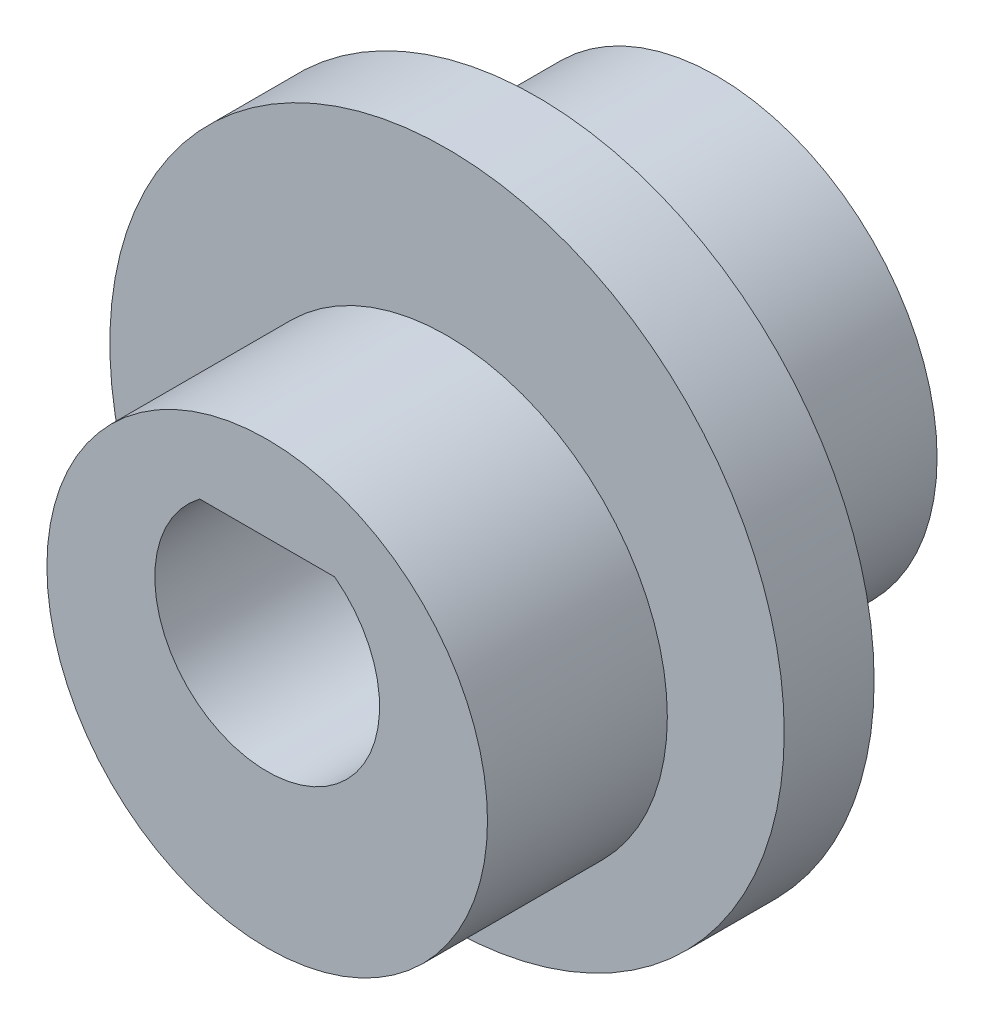
ISO-10303-21;
HEADER;
FILE_DESCRIPTION(('STEP AP214'),'2;1');
FILE_NAME('part.step','',(''),(''),'','','');
FILE_SCHEMA(('AUTOMOTIVE_DESIGN { 1 0 10303 214 1 1 1 1 }'));
ENDSEC;
DATA;
#1=APPLICATION_CONTEXT('core data for automotive mechanical design processes');
#2=APPLICATION_PROTOCOL_DEFINITION('international standard','automotive_design',2000,#1);
#3=PRODUCT_CONTEXT('',#1,'mechanical');
#4=PRODUCT('Part','Part','',(#3));
#5=PRODUCT_RELATED_PRODUCT_CATEGORY('part','',(#4));
#6=PRODUCT_DEFINITION_FORMATION('','',#4);
#7=PRODUCT_DEFINITION_CONTEXT('part definition',#1,'design');
#8=PRODUCT_DEFINITION('design','',#6,#7);
#9=PRODUCT_DEFINITION_SHAPE('','',#8);
#10=(LENGTH_UNIT() NAMED_UNIT(*) SI_UNIT(.MILLI.,.METRE.));
#11=(NAMED_UNIT(*) PLANE_ANGLE_UNIT() SI_UNIT($,.RADIAN.));
#12=(NAMED_UNIT(*) SI_UNIT($,.STERADIAN.) SOLID_ANGLE_UNIT());
#13=UNCERTAINTY_MEASURE_WITH_UNIT(LENGTH_MEASURE(1.E-05),#10,'distance_accuracy_value','');
#14=(GEOMETRIC_REPRESENTATION_CONTEXT(3) GLOBAL_UNCERTAINTY_ASSIGNED_CONTEXT((#13)) GLOBAL_UNIT_ASSIGNED_CONTEXT((#10,
#11,#12)) REPRESENTATION_CONTEXT('',''));
#15=CARTESIAN_POINT('',(0.,0.,0.));
#16=DIRECTION('',(0.,0.,1.));
#17=DIRECTION('',(1.,0.,0.));
#18=AXIS2_PLACEMENT_3D('',#15,#16,#17);
#19=CARTESIAN_POINT('',(0.,1.,4.));
#20=DIRECTION('',(0.,0.,-1.));
#21=DIRECTION('',(-1.,0.,0.));
#22=AXIS2_PLACEMENT_3D('',#19,#20,#21);
#23=CYLINDRICAL_SURFACE('',#22,4.9);
#24=CARTESIAN_POINT('',(0.,1.,4.));
#25=DIRECTION('',(0.,0.,1.));
#26=DIRECTION('',(1.,0.,0.));
#27=AXIS2_PLACEMENT_3D('',#24,#25,#26);
#28=CIRCLE('',#27,4.9);
#29=CARTESIAN_POINT('',(4.9,1.,4.));
#30=VERTEX_POINT('',#29);
#31=EDGE_CURVE('E42',#30,#30,#28,.T.);
#32=ORIENTED_EDGE('',*,*,#31,.F.);
#33=EDGE_LOOP('',(#32));
#34=FACE_BOUND('',#33,.T.);
#35=CARTESIAN_POINT('',(0.,1.,0.));
#36=DIRECTION('',(0.,0.,1.));
#37=DIRECTION('',(1.,0.,0.));
#38=AXIS2_PLACEMENT_3D('',#35,#36,#37);
#39=CIRCLE('',#38,4.9);
#40=CARTESIAN_POINT('',(4.9,1.,0.));
#41=VERTEX_POINT('',#40);
#42=EDGE_CURVE('E37',#41,#41,#39,.T.);
#43=ORIENTED_EDGE('',*,*,#42,.T.);
#44=EDGE_LOOP('',(#43));
#45=FACE_BOUND('',#44,.T.);
#46=ADVANCED_FACE('F34',(#34,#45),#23,.T.);
#47=CARTESIAN_POINT('',(0.,0.,0.));
#48=DIRECTION('',(0.,0.,1.));
#49=DIRECTION('',(1.,0.,0.));
#50=AXIS2_PLACEMENT_3D('',#47,#48,#49);
#51=PLANE('',#50);
#52=DIRECTION('',(-1.,0.,0.));
#53=VECTOR('',#52,1.);
#54=CARTESIAN_POINT('',(-1.5,2.,0.));
#55=LINE('',#54,#53);
#56=CARTESIAN_POINT('',(1.5,2.,0.));
#57=VERTEX_POINT('',#56);
#58=CARTESIAN_POINT('',(-1.5,2.,0.));
#59=VERTEX_POINT('',#58);
#60=EDGE_CURVE('E78',#57,#59,#55,.T.);
#61=ORIENTED_EDGE('',*,*,#60,.T.);
#62=CARTESIAN_POINT('',(0.,0.,0.));
#63=DIRECTION('',(0.,0.,1.));
#64=DIRECTION('',(1.,0.,0.));
#65=AXIS2_PLACEMENT_3D('',#62,#63,#64);
#66=CIRCLE('',#65,2.5);
#67=EDGE_CURVE('E50',#59,#57,#66,.T.);
#68=ORIENTED_EDGE('',*,*,#67,.T.);
#69=EDGE_LOOP('',(#61,#68));
#70=FACE_BOUND('',#69,.T.);
#71=ORIENTED_EDGE('',*,*,#42,.F.);
#72=EDGE_LOOP('',(#71));
#73=FACE_BOUND('',#72,.T.);
#74=ADVANCED_FACE('F96',(#70,#73),#51,.F.);
#75=CARTESIAN_POINT('',(0.,0.,6.));
#76=DIRECTION('',(0.,0.,-1.));
#77=DIRECTION('',(-1.,0.,0.));
#78=AXIS2_PLACEMENT_3D('',#75,#76,#77);
#79=CYLINDRICAL_SURFACE('',#78,7.5);
#80=CARTESIAN_POINT('',(0.,0.,6.));
#81=DIRECTION('',(0.,0.,1.));
#82=DIRECTION('',(1.,0.,0.));
#83=AXIS2_PLACEMENT_3D('',#80,#81,#82);
#84=CIRCLE('',#83,7.5);
#85=CARTESIAN_POINT('',(7.5,0.,6.));
#86=VERTEX_POINT('',#85);
#87=EDGE_CURVE('E85',#86,#86,#84,.T.);
#88=ORIENTED_EDGE('',*,*,#87,.F.);
#89=EDGE_LOOP('',(#88));
#90=FACE_BOUND('',#89,.T.);
#91=CARTESIAN_POINT('',(0.,0.,4.));
#92=DIRECTION('',(0.,0.,1.));
#93=DIRECTION('',(1.,0.,0.));
#94=AXIS2_PLACEMENT_3D('',#91,#92,#93);
#95=CIRCLE('',#94,7.5);
#96=CARTESIAN_POINT('',(7.5,0.,4.));
#97=VERTEX_POINT('',#96);
#98=EDGE_CURVE('E83',#97,#97,#95,.T.);
#99=ORIENTED_EDGE('',*,*,#98,.T.);
#100=EDGE_LOOP('',(#99));
#101=FACE_BOUND('',#100,.T.);
#102=ADVANCED_FACE('F98',(#90,#101),#79,.T.);
#103=CARTESIAN_POINT('',(0.,0.,6.));
#104=DIRECTION('',(0.,0.,1.));
#105=DIRECTION('',(1.,0.,0.));
#106=AXIS2_PLACEMENT_3D('',#103,#104,#105);
#107=PLANE('',#106);
#108=CARTESIAN_POINT('',(0.,-1.,6.));
#109=DIRECTION('',(0.,0.,1.));
#110=DIRECTION('',(1.,0.,0.));
#111=AXIS2_PLACEMENT_3D('',#108,#109,#110);
#112=CIRCLE('',#111,4.9);
#113=CARTESIAN_POINT('',(4.9,-1.,6.));
#114=VERTEX_POINT('',#113);
#115=EDGE_CURVE('E11',#114,#114,#112,.T.);
#116=ORIENTED_EDGE('',*,*,#115,.F.);
#117=EDGE_LOOP('',(#116));
#118=FACE_BOUND('',#117,.T.);
#119=ORIENTED_EDGE('',*,*,#87,.T.);
#120=EDGE_LOOP('',(#119));
#121=FACE_BOUND('',#120,.T.);
#122=ADVANCED_FACE('F104',(#118,#121),#107,.T.);
#123=CARTESIAN_POINT('',(0.,0.,4.));
#124=DIRECTION('',(0.,0.,1.));
#125=DIRECTION('',(1.,0.,0.));
#126=AXIS2_PLACEMENT_3D('',#123,#124,#125);
#127=PLANE('',#126);
#128=ORIENTED_EDGE('',*,*,#31,.T.);
#129=EDGE_LOOP('',(#128));
#130=FACE_BOUND('',#129,.T.);
#131=ORIENTED_EDGE('',*,*,#98,.F.);
#132=EDGE_LOOP('',(#131));
#133=FACE_BOUND('',#132,.T.);
#134=ADVANCED_FACE('F109',(#130,#133),#127,.F.);
#135=CARTESIAN_POINT('',(0.,-1.,10.));
#136=DIRECTION('',(0.,0.,-1.));
#137=DIRECTION('',(-1.,0.,0.));
#138=AXIS2_PLACEMENT_3D('',#135,#136,#137);
#139=CYLINDRICAL_SURFACE('',#138,4.9);
#140=CARTESIAN_POINT('',(0.,-1.,10.));
#141=DIRECTION('',(0.,0.,1.));
#142=DIRECTION('',(1.,0.,0.));
#143=AXIS2_PLACEMENT_3D('',#140,#141,#142);
#144=CIRCLE('',#143,4.9);
#145=CARTESIAN_POINT('',(4.9,-1.,10.));
#146=VERTEX_POINT('',#145);
#147=EDGE_CURVE('E66',#146,#146,#144,.T.);
#148=ORIENTED_EDGE('',*,*,#147,.F.);
#149=EDGE_LOOP('',(#148));
#150=FACE_BOUND('',#149,.T.);
#151=ORIENTED_EDGE('',*,*,#115,.T.);
#152=EDGE_LOOP('',(#151));
#153=FACE_BOUND('',#152,.T.);
#154=ADVANCED_FACE('F112',(#150,#153),#139,.T.);
#155=CARTESIAN_POINT('',(0.,-1.,10.));
#156=DIRECTION('',(0.,0.,1.));
#157=DIRECTION('',(1.,0.,0.));
#158=AXIS2_PLACEMENT_3D('',#155,#156,#157);
#159=PLANE('',#158);
#160=CARTESIAN_POINT('',(0.,0.,10.));
#161=DIRECTION('',(0.,0.,1.));
#162=DIRECTION('',(1.,0.,0.));
#163=AXIS2_PLACEMENT_3D('',#160,#161,#162);
#164=CIRCLE('',#163,2.5);
#165=CARTESIAN_POINT('',(-1.5,2.,10.));
#166=VERTEX_POINT('',#165);
#167=CARTESIAN_POINT('',(1.5,2.,10.));
#168=VERTEX_POINT('',#167);
#169=EDGE_CURVE('E55',#166,#168,#164,.T.);
#170=ORIENTED_EDGE('',*,*,#169,.F.);
#171=DIRECTION('',(-1.,0.,0.));
#172=VECTOR('',#171,1.);
#173=CARTESIAN_POINT('',(-1.5,2.,10.));
#174=LINE('',#173,#172);
#175=EDGE_CURVE('E70',#168,#166,#174,.T.);
#176=ORIENTED_EDGE('',*,*,#175,.F.);
#177=EDGE_LOOP('',(#170,#176));
#178=FACE_BOUND('',#177,.T.);
#179=ORIENTED_EDGE('',*,*,#147,.T.);
#180=EDGE_LOOP('',(#179));
#181=FACE_BOUND('',#180,.T.);
#182=ADVANCED_FACE('F74',(#178,#181),#159,.T.);
#183=CARTESIAN_POINT('',(0.,0.,0.));
#184=DIRECTION('',(0.,0.,1.));
#185=DIRECTION('',(1.,0.,0.));
#186=AXIS2_PLACEMENT_3D('',#183,#184,#185);
#187=CYLINDRICAL_SURFACE('',#186,2.5);
#188=ORIENTED_EDGE('',*,*,#169,.T.);
#189=DIRECTION('',(0.,0.,1.));
#190=VECTOR('',#189,1.);
#191=CARTESIAN_POINT('',(1.5,2.,0.));
#192=LINE('',#191,#190);
#193=EDGE_CURVE('E67',#57,#168,#192,.T.);
#194=ORIENTED_EDGE('',*,*,#193,.F.);
#195=ORIENTED_EDGE('',*,*,#67,.F.);
#196=DIRECTION('',(0.,0.,1.));
#197=VECTOR('',#196,1.);
#198=CARTESIAN_POINT('',(-1.5,2.,0.));
#199=LINE('',#198,#197);
#200=EDGE_CURVE('E60',#59,#166,#199,.T.);
#201=ORIENTED_EDGE('',*,*,#200,.T.);
#202=EDGE_LOOP('',(#188,#194,#195,#201));
#203=FACE_BOUND('',#202,.T.);
#204=ADVANCED_FACE('F62',(#203),#187,.F.);
#205=CARTESIAN_POINT('',(-1.5,2.,0.));
#206=DIRECTION('',(0.,1.,0.));
#207=DIRECTION('',(0.,0.,1.));
#208=AXIS2_PLACEMENT_3D('',#205,#206,#207);
#209=PLANE('',#208);
#210=ORIENTED_EDGE('',*,*,#175,.T.);
#211=ORIENTED_EDGE('',*,*,#200,.F.);
#212=ORIENTED_EDGE('',*,*,#60,.F.);
#213=ORIENTED_EDGE('',*,*,#193,.T.);
#214=EDGE_LOOP('',(#210,#211,#212,#213));
#215=FACE_BOUND('',#214,.T.);
#216=ADVANCED_FACE('F71',(#215),#209,.F.);
#217=CLOSED_SHELL('',(#46,#74,#102,#122,#134,#154,#182,#204,#216));
#218=MANIFOLD_SOLID_BREP('B2',#217);
#219=ADVANCED_BREP_SHAPE_REPRESENTATION('',(#18,#218),#14);
#220=SHAPE_DEFINITION_REPRESENTATION(#9,#219);
ENDSEC;
END-ISO-10303-21;
